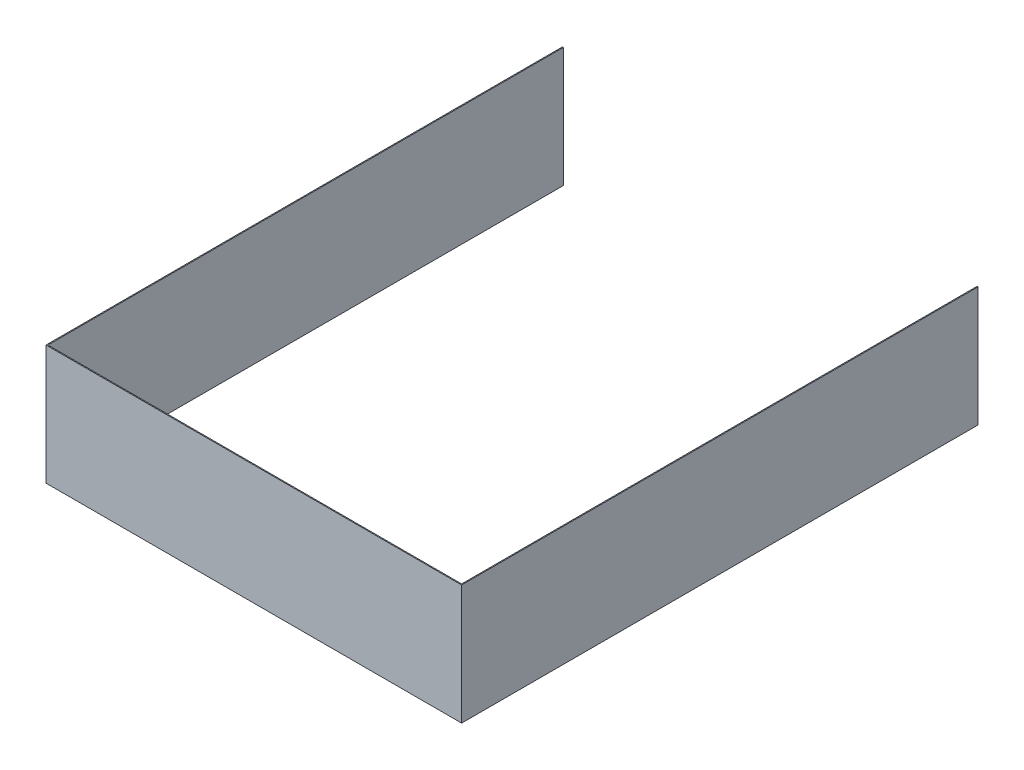
ISO-10303-21;
HEADER;
FILE_DESCRIPTION(('STEP AP214'),'2;1');
FILE_NAME('part.step','',(''),(''),'','','');
FILE_SCHEMA(('AUTOMOTIVE_DESIGN { 1 0 10303 214 1 1 1 1 }'));
ENDSEC;
DATA;
#1=APPLICATION_CONTEXT('core data for automotive mechanical design processes');
#2=APPLICATION_PROTOCOL_DEFINITION('international standard','automotive_design',2000,#1);
#3=PRODUCT_CONTEXT('',#1,'mechanical');
#4=PRODUCT('Part','Part','',(#3));
#5=PRODUCT_RELATED_PRODUCT_CATEGORY('part','',(#4));
#6=PRODUCT_DEFINITION_FORMATION('','',#4);
#7=PRODUCT_DEFINITION_CONTEXT('part definition',#1,'design');
#8=PRODUCT_DEFINITION('design','',#6,#7);
#9=PRODUCT_DEFINITION_SHAPE('','',#8);
#10=(LENGTH_UNIT() NAMED_UNIT(*) SI_UNIT(.MILLI.,.METRE.));
#11=(NAMED_UNIT(*) PLANE_ANGLE_UNIT() SI_UNIT($,.RADIAN.));
#12=(NAMED_UNIT(*) SI_UNIT($,.STERADIAN.) SOLID_ANGLE_UNIT());
#13=UNCERTAINTY_MEASURE_WITH_UNIT(LENGTH_MEASURE(1.E-05),#10,'distance_accuracy_value','');
#14=(GEOMETRIC_REPRESENTATION_CONTEXT(3) GLOBAL_UNCERTAINTY_ASSIGNED_CONTEXT((#13)) GLOBAL_UNIT_ASSIGNED_CONTEXT((#10,
#11,#12)) REPRESENTATION_CONTEXT('',''));
#15=CARTESIAN_POINT('',(0.,0.,0.));
#16=DIRECTION('',(0.,0.,1.));
#17=DIRECTION('',(1.,0.,0.));
#18=AXIS2_PLACEMENT_3D('',#15,#16,#17);
#19=CARTESIAN_POINT('',(21.5,200.,-800.));
#20=DIRECTION('',(0.,0.,1.));
#21=DIRECTION('',(1.,0.,0.));
#22=AXIS2_PLACEMENT_3D('',#19,#20,#21);
#23=PLANE('',#22);
#24=DIRECTION('',(-1.,0.,0.));
#25=VECTOR('',#24,1.);
#26=CARTESIAN_POINT('',(21.5,10.,-800.));
#27=LINE('',#26,#25);
#28=CARTESIAN_POINT('',(21.5,10.,-800.));
#29=VERTEX_POINT('',#28);
#30=CARTESIAN_POINT('',(20.,10.,-800.));
#31=VERTEX_POINT('',#30);
#32=EDGE_CURVE('E135',#29,#31,#27,.T.);
#33=ORIENTED_EDGE('',*,*,#32,.T.);
#34=DIRECTION('',(0.,-1.,0.));
#35=VECTOR('',#34,1.);
#36=CARTESIAN_POINT('',(20.,200.,-800.));
#37=LINE('',#36,#35);
#38=CARTESIAN_POINT('',(20.,200.,-800.));
#39=VERTEX_POINT('',#38);
#40=EDGE_CURVE('E11',#39,#31,#37,.T.);
#41=ORIENTED_EDGE('',*,*,#40,.F.);
#42=DIRECTION('',(-1.,0.,0.));
#43=VECTOR('',#42,1.);
#44=CARTESIAN_POINT('',(21.5,200.,-800.));
#45=LINE('',#44,#43);
#46=CARTESIAN_POINT('',(21.5,200.,-800.));
#47=VERTEX_POINT('',#46);
#48=EDGE_CURVE('E149',#47,#39,#45,.T.);
#49=ORIENTED_EDGE('',*,*,#48,.F.);
#50=DIRECTION('',(0.,-1.,0.));
#51=VECTOR('',#50,1.);
#52=CARTESIAN_POINT('',(21.5,200.,-800.));
#53=LINE('',#52,#51);
#54=EDGE_CURVE('E131',#47,#29,#53,.T.);
#55=ORIENTED_EDGE('',*,*,#54,.T.);
#56=EDGE_LOOP('',(#33,#41,#49,#55));
#57=FACE_BOUND('',#56,.T.);
#58=ADVANCED_FACE('F39',(#57),#23,.F.);
#59=CARTESIAN_POINT('',(20.,200.,-800.));
#60=DIRECTION('',(1.,0.,0.));
#61=DIRECTION('',(0.,0.,-1.));
#62=AXIS2_PLACEMENT_3D('',#59,#60,#61);
#63=PLANE('',#62);
#64=DIRECTION('',(0.,0.,1.));
#65=VECTOR('',#64,1.);
#66=CARTESIAN_POINT('',(20.,10.,-800.));
#67=LINE('',#66,#65);
#68=CARTESIAN_POINT('',(20.,10.,20.));
#69=VERTEX_POINT('',#68);
#70=EDGE_CURVE('E138',#31,#69,#67,.T.);
#71=ORIENTED_EDGE('',*,*,#70,.T.);
#72=DIRECTION('',(0.,-1.,0.));
#73=VECTOR('',#72,1.);
#74=CARTESIAN_POINT('',(20.,200.,20.));
#75=LINE('',#74,#73);
#76=CARTESIAN_POINT('',(20.,200.,20.));
#77=VERTEX_POINT('',#76);
#78=EDGE_CURVE('E47',#77,#69,#75,.T.);
#79=ORIENTED_EDGE('',*,*,#78,.F.);
#80=DIRECTION('',(0.,0.,1.));
#81=VECTOR('',#80,1.);
#82=CARTESIAN_POINT('',(20.,200.,-800.));
#83=LINE('',#82,#81);
#84=EDGE_CURVE('E98',#39,#77,#83,.T.);
#85=ORIENTED_EDGE('',*,*,#84,.F.);
#86=ORIENTED_EDGE('',*,*,#40,.T.);
#87=EDGE_LOOP('',(#71,#79,#85,#86));
#88=FACE_BOUND('',#87,.T.);
#89=ADVANCED_FACE('F184',(#88),#63,.F.);
#90=CARTESIAN_POINT('',(20.,200.,20.));
#91=DIRECTION('',(0.,0.,-1.));
#92=DIRECTION('',(-1.,0.,0.));
#93=AXIS2_PLACEMENT_3D('',#90,#91,#92);
#94=PLANE('',#93);
#95=DIRECTION('',(1.,0.,0.));
#96=VECTOR('',#95,1.);
#97=CARTESIAN_POINT('',(20.,10.,20.));
#98=LINE('',#97,#96);
#99=CARTESIAN_POINT('',(680.,10.,20.));
#100=VERTEX_POINT('',#99);
#101=EDGE_CURVE('E140',#69,#100,#98,.T.);
#102=ORIENTED_EDGE('',*,*,#101,.T.);
#103=DIRECTION('',(0.,-1.,0.));
#104=VECTOR('',#103,1.);
#105=CARTESIAN_POINT('',(680.,200.,20.));
#106=LINE('',#105,#104);
#107=CARTESIAN_POINT('',(680.,200.,20.));
#108=VERTEX_POINT('',#107);
#109=EDGE_CURVE('E156',#108,#100,#106,.T.);
#110=ORIENTED_EDGE('',*,*,#109,.F.);
#111=DIRECTION('',(1.,0.,0.));
#112=VECTOR('',#111,1.);
#113=CARTESIAN_POINT('',(20.,200.,20.));
#114=LINE('',#113,#112);
#115=EDGE_CURVE('E164',#77,#108,#114,.T.);
#116=ORIENTED_EDGE('',*,*,#115,.F.);
#117=ORIENTED_EDGE('',*,*,#78,.T.);
#118=EDGE_LOOP('',(#102,#110,#116,#117));
#119=FACE_BOUND('',#118,.T.);
#120=ADVANCED_FACE('F162',(#119),#94,.F.);
#121=CARTESIAN_POINT('',(680.,200.,20.));
#122=DIRECTION('',(-1.,0.,0.));
#123=DIRECTION('',(0.,0.,1.));
#124=AXIS2_PLACEMENT_3D('',#121,#122,#123);
#125=PLANE('',#124);
#126=DIRECTION('',(0.,0.,-1.));
#127=VECTOR('',#126,1.);
#128=CARTESIAN_POINT('',(680.,10.,20.));
#129=LINE('',#128,#127);
#130=CARTESIAN_POINT('',(680.,10.,-800.));
#131=VERTEX_POINT('',#130);
#132=EDGE_CURVE('E142',#100,#131,#129,.T.);
#133=ORIENTED_EDGE('',*,*,#132,.T.);
#134=DIRECTION('',(0.,-1.,0.));
#135=VECTOR('',#134,1.);
#136=CARTESIAN_POINT('',(680.,200.,-800.));
#137=LINE('',#136,#135);
#138=CARTESIAN_POINT('',(680.,200.,-800.));
#139=VERTEX_POINT('',#138);
#140=EDGE_CURVE('E153',#139,#131,#137,.T.);
#141=ORIENTED_EDGE('',*,*,#140,.F.);
#142=DIRECTION('',(0.,0.,-1.));
#143=VECTOR('',#142,1.);
#144=CARTESIAN_POINT('',(680.,200.,20.));
#145=LINE('',#144,#143);
#146=EDGE_CURVE('E176',#108,#139,#145,.T.);
#147=ORIENTED_EDGE('',*,*,#146,.F.);
#148=ORIENTED_EDGE('',*,*,#109,.T.);
#149=EDGE_LOOP('',(#133,#141,#147,#148));
#150=FACE_BOUND('',#149,.T.);
#151=ADVANCED_FACE('F172',(#150),#125,.F.);
#152=CARTESIAN_POINT('',(680.,200.,-800.));
#153=DIRECTION('',(0.,0.,1.));
#154=DIRECTION('',(1.,0.,0.));
#155=AXIS2_PLACEMENT_3D('',#152,#153,#154);
#156=PLANE('',#155);
#157=DIRECTION('',(-1.,0.,0.));
#158=VECTOR('',#157,1.);
#159=CARTESIAN_POINT('',(680.,10.,-800.));
#160=LINE('',#159,#158);
#161=CARTESIAN_POINT('',(678.5,10.,-800.));
#162=VERTEX_POINT('',#161);
#163=EDGE_CURVE('E144',#131,#162,#160,.T.);
#164=ORIENTED_EDGE('',*,*,#163,.T.);
#165=DIRECTION('',(0.,-1.,0.));
#166=VECTOR('',#165,1.);
#167=CARTESIAN_POINT('',(678.5,200.,-800.));
#168=LINE('',#167,#166);
#169=CARTESIAN_POINT('',(678.5,200.,-800.));
#170=VERTEX_POINT('',#169);
#171=EDGE_CURVE('E126',#170,#162,#168,.T.);
#172=ORIENTED_EDGE('',*,*,#171,.F.);
#173=DIRECTION('',(-1.,0.,0.));
#174=VECTOR('',#173,1.);
#175=CARTESIAN_POINT('',(680.,200.,-800.));
#176=LINE('',#175,#174);
#177=EDGE_CURVE('E117',#139,#170,#176,.T.);
#178=ORIENTED_EDGE('',*,*,#177,.F.);
#179=ORIENTED_EDGE('',*,*,#140,.T.);
#180=EDGE_LOOP('',(#164,#172,#178,#179));
#181=FACE_BOUND('',#180,.T.);
#182=ADVANCED_FACE('F175',(#181),#156,.F.);
#183=CARTESIAN_POINT('',(678.5,200.,-800.));
#184=DIRECTION('',(1.,0.,0.));
#185=DIRECTION('',(0.,0.,-1.));
#186=AXIS2_PLACEMENT_3D('',#183,#184,#185);
#187=PLANE('',#186);
#188=DIRECTION('',(0.,0.,1.));
#189=VECTOR('',#188,1.);
#190=CARTESIAN_POINT('',(678.5,10.,-800.));
#191=LINE('',#190,#189);
#192=CARTESIAN_POINT('',(678.5,10.,18.5));
#193=VERTEX_POINT('',#192);
#194=EDGE_CURVE('E125',#162,#193,#191,.T.);
#195=ORIENTED_EDGE('',*,*,#194,.T.);
#196=DIRECTION('',(0.,-1.,0.));
#197=VECTOR('',#196,1.);
#198=CARTESIAN_POINT('',(678.5,200.,18.5));
#199=LINE('',#198,#197);
#200=CARTESIAN_POINT('',(678.5,200.,18.5));
#201=VERTEX_POINT('',#200);
#202=EDGE_CURVE('E122',#201,#193,#199,.T.);
#203=ORIENTED_EDGE('',*,*,#202,.F.);
#204=DIRECTION('',(0.,0.,1.));
#205=VECTOR('',#204,1.);
#206=CARTESIAN_POINT('',(678.5,200.,-800.));
#207=LINE('',#206,#205);
#208=EDGE_CURVE('E111',#170,#201,#207,.T.);
#209=ORIENTED_EDGE('',*,*,#208,.F.);
#210=ORIENTED_EDGE('',*,*,#171,.T.);
#211=EDGE_LOOP('',(#195,#203,#209,#210));
#212=FACE_BOUND('',#211,.T.);
#213=ADVANCED_FACE('F123',(#212),#187,.F.);
#214=CARTESIAN_POINT('',(678.5,200.,18.5));
#215=DIRECTION('',(0.,0.,1.));
#216=DIRECTION('',(1.,0.,0.));
#217=AXIS2_PLACEMENT_3D('',#214,#215,#216);
#218=PLANE('',#217);
#219=DIRECTION('',(-1.,0.,0.));
#220=VECTOR('',#219,1.);
#221=CARTESIAN_POINT('',(678.5,10.,18.5));
#222=LINE('',#221,#220);
#223=CARTESIAN_POINT('',(21.5,10.,18.5));
#224=VERTEX_POINT('',#223);
#225=EDGE_CURVE('E84',#193,#224,#222,.T.);
#226=ORIENTED_EDGE('',*,*,#225,.T.);
#227=DIRECTION('',(0.,-1.,0.));
#228=VECTOR('',#227,1.);
#229=CARTESIAN_POINT('',(21.5,200.,18.5));
#230=LINE('',#229,#228);
#231=CARTESIAN_POINT('',(21.5,200.,18.5));
#232=VERTEX_POINT('',#231);
#233=EDGE_CURVE('E127',#232,#224,#230,.T.);
#234=ORIENTED_EDGE('',*,*,#233,.F.);
#235=DIRECTION('',(-1.,0.,0.));
#236=VECTOR('',#235,1.);
#237=CARTESIAN_POINT('',(678.5,200.,18.5));
#238=LINE('',#237,#236);
#239=EDGE_CURVE('E115',#201,#232,#238,.T.);
#240=ORIENTED_EDGE('',*,*,#239,.F.);
#241=ORIENTED_EDGE('',*,*,#202,.T.);
#242=EDGE_LOOP('',(#226,#234,#240,#241));
#243=FACE_BOUND('',#242,.T.);
#244=ADVANCED_FACE('F129',(#243),#218,.F.);
#245=CARTESIAN_POINT('',(21.5,200.,18.5));
#246=DIRECTION('',(-1.,0.,0.));
#247=DIRECTION('',(0.,0.,1.));
#248=AXIS2_PLACEMENT_3D('',#245,#246,#247);
#249=PLANE('',#248);
#250=DIRECTION('',(0.,0.,-1.));
#251=VECTOR('',#250,1.);
#252=CARTESIAN_POINT('',(21.5,10.,18.5));
#253=LINE('',#252,#251);
#254=EDGE_CURVE('E90',#224,#29,#253,.T.);
#255=ORIENTED_EDGE('',*,*,#254,.T.);
#256=ORIENTED_EDGE('',*,*,#54,.F.);
#257=DIRECTION('',(0.,0.,-1.));
#258=VECTOR('',#257,1.);
#259=CARTESIAN_POINT('',(21.5,200.,18.5));
#260=LINE('',#259,#258);
#261=EDGE_CURVE('E55',#232,#47,#260,.T.);
#262=ORIENTED_EDGE('',*,*,#261,.F.);
#263=ORIENTED_EDGE('',*,*,#233,.T.);
#264=EDGE_LOOP('',(#255,#256,#262,#263));
#265=FACE_BOUND('',#264,.T.);
#266=ADVANCED_FACE('F200',(#265),#249,.F.);
#267=CARTESIAN_POINT('',(0.,200.,0.));
#268=DIRECTION('',(0.,1.,0.));
#269=DIRECTION('',(0.,0.,1.));
#270=AXIS2_PLACEMENT_3D('',#267,#268,#269);
#271=PLANE('',#270);
#272=ORIENTED_EDGE('',*,*,#48,.T.);
#273=ORIENTED_EDGE('',*,*,#84,.T.);
#274=ORIENTED_EDGE('',*,*,#115,.T.);
#275=ORIENTED_EDGE('',*,*,#146,.T.);
#276=ORIENTED_EDGE('',*,*,#177,.T.);
#277=ORIENTED_EDGE('',*,*,#208,.T.);
#278=ORIENTED_EDGE('',*,*,#239,.T.);
#279=ORIENTED_EDGE('',*,*,#261,.T.);
#280=EDGE_LOOP('',(#272,#273,#274,#275,#276,#277,#278,#279));
#281=FACE_BOUND('',#280,.T.);
#282=ADVANCED_FACE('F113',(#281),#271,.T.);
#283=CARTESIAN_POINT('',(0.,10.,0.));
#284=DIRECTION('',(0.,1.,0.));
#285=DIRECTION('',(0.,0.,1.));
#286=AXIS2_PLACEMENT_3D('',#283,#284,#285);
#287=PLANE('',#286);
#288=ORIENTED_EDGE('',*,*,#32,.F.);
#289=ORIENTED_EDGE('',*,*,#254,.F.);
#290=ORIENTED_EDGE('',*,*,#225,.F.);
#291=ORIENTED_EDGE('',*,*,#194,.F.);
#292=ORIENTED_EDGE('',*,*,#163,.F.);
#293=ORIENTED_EDGE('',*,*,#132,.F.);
#294=ORIENTED_EDGE('',*,*,#101,.F.);
#295=ORIENTED_EDGE('',*,*,#70,.F.);
#296=EDGE_LOOP('',(#288,#289,#290,#291,#292,#293,#294,#295));
#297=FACE_BOUND('',#296,.T.);
#298=ADVANCED_FACE('F168',(#297),#287,.F.);
#299=CLOSED_SHELL('',(#58,#89,#120,#151,#182,#213,#244,#266,#282,#298));
#300=MANIFOLD_SOLID_BREP('B2',#299);
#301=ADVANCED_BREP_SHAPE_REPRESENTATION('',(#18,#300),#14);
#302=SHAPE_DEFINITION_REPRESENTATION(#9,#301);
ENDSEC;
END-ISO-10303-21;
